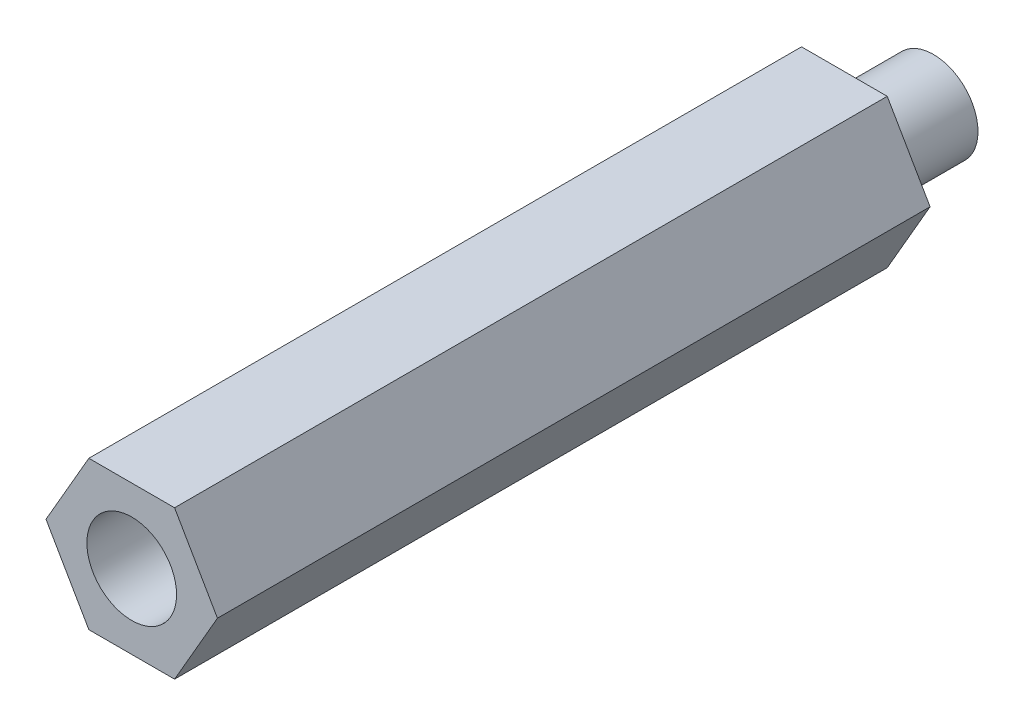
ISO-10303-21;
HEADER;
FILE_DESCRIPTION(('STEP AP214'),'2;1');
FILE_NAME('part.step','',(''),(''),'','','');
FILE_SCHEMA(('AUTOMOTIVE_DESIGN { 1 0 10303 214 1 1 1 1 }'));
ENDSEC;
DATA;
#1=APPLICATION_CONTEXT('core data for automotive mechanical design processes');
#2=APPLICATION_PROTOCOL_DEFINITION('international standard','automotive_design',2000,#1);
#3=PRODUCT_CONTEXT('',#1,'mechanical');
#4=PRODUCT('Part','Part','',(#3));
#5=PRODUCT_RELATED_PRODUCT_CATEGORY('part','',(#4));
#6=PRODUCT_DEFINITION_FORMATION('','',#4);
#7=PRODUCT_DEFINITION_CONTEXT('part definition',#1,'design');
#8=PRODUCT_DEFINITION('design','',#6,#7);
#9=PRODUCT_DEFINITION_SHAPE('','',#8);
#10=(LENGTH_UNIT() NAMED_UNIT(*) SI_UNIT(.MILLI.,.METRE.));
#11=(NAMED_UNIT(*) PLANE_ANGLE_UNIT() SI_UNIT($,.RADIAN.));
#12=(NAMED_UNIT(*) SI_UNIT($,.STERADIAN.) SOLID_ANGLE_UNIT());
#13=UNCERTAINTY_MEASURE_WITH_UNIT(LENGTH_MEASURE(1.E-05),#10,'distance_accuracy_value','');
#14=(GEOMETRIC_REPRESENTATION_CONTEXT(3) GLOBAL_UNCERTAINTY_ASSIGNED_CONTEXT((#13)) GLOBAL_UNIT_ASSIGNED_CONTEXT((#10,
#11,#12)) REPRESENTATION_CONTEXT('',''));
#15=CARTESIAN_POINT('',(0.,0.,0.));
#16=DIRECTION('',(0.,0.,1.));
#17=DIRECTION('',(1.,0.,0.));
#18=AXIS2_PLACEMENT_3D('',#15,#16,#17);
#19=CARTESIAN_POINT('',(0.,0.,24.));
#20=DIRECTION('',(0.,0.,1.));
#21=DIRECTION('',(1.,0.,0.));
#22=AXIS2_PLACEMENT_3D('',#19,#20,#21);
#23=PLANE('',#22);
#24=DIRECTION('',(0.5,0.866025403784439,0.));
#25=VECTOR('',#24,1.);
#26=CARTESIAN_POINT('',(1.44337567297406,-2.5,24.));
#27=LINE('',#26,#25);
#28=CARTESIAN_POINT('',(1.44337567297406,-2.5,24.));
#29=VERTEX_POINT('',#28);
#30=CARTESIAN_POINT('',(2.88675134594813,0.,24.));
#31=VERTEX_POINT('',#30);
#32=EDGE_CURVE('E145',#29,#31,#27,.T.);
#33=ORIENTED_EDGE('',*,*,#32,.T.);
#34=DIRECTION('',(-0.5,0.866025403784439,0.));
#35=VECTOR('',#34,1.);
#36=CARTESIAN_POINT('',(2.88675134594813,0.,24.));
#37=LINE('',#36,#35);
#38=CARTESIAN_POINT('',(1.44337567297406,2.5,24.));
#39=VERTEX_POINT('',#38);
#40=EDGE_CURVE('E105',#31,#39,#37,.T.);
#41=ORIENTED_EDGE('',*,*,#40,.T.);
#42=DIRECTION('',(-1.,0.,0.));
#43=VECTOR('',#42,1.);
#44=CARTESIAN_POINT('',(1.44337567297406,2.5,24.));
#45=LINE('',#44,#43);
#46=CARTESIAN_POINT('',(-1.44337567297406,2.5,24.));
#47=VERTEX_POINT('',#46);
#48=EDGE_CURVE('E113',#39,#47,#45,.T.);
#49=ORIENTED_EDGE('',*,*,#48,.T.);
#50=DIRECTION('',(-0.5,-0.866025403784439,0.));
#51=VECTOR('',#50,1.);
#52=CARTESIAN_POINT('',(-1.44337567297406,2.5,24.));
#53=LINE('',#52,#51);
#54=CARTESIAN_POINT('',(-2.88675134594813,0.,24.));
#55=VERTEX_POINT('',#54);
#56=EDGE_CURVE('E108',#47,#55,#53,.T.);
#57=ORIENTED_EDGE('',*,*,#56,.T.);
#58=DIRECTION('',(0.5,-0.866025403784439,0.));
#59=VECTOR('',#58,1.);
#60=CARTESIAN_POINT('',(-2.88675134594813,0.,24.));
#61=LINE('',#60,#59);
#62=CARTESIAN_POINT('',(-1.44337567297407,-2.5,24.));
#63=VERTEX_POINT('',#62);
#64=EDGE_CURVE('E114',#55,#63,#61,.T.);
#65=ORIENTED_EDGE('',*,*,#64,.T.);
#66=DIRECTION('',(1.,0.,0.));
#67=VECTOR('',#66,1.);
#68=CARTESIAN_POINT('',(-1.44337567297407,-2.5,24.));
#69=LINE('',#68,#67);
#70=EDGE_CURVE('E64',#63,#29,#69,.T.);
#71=ORIENTED_EDGE('',*,*,#70,.T.);
#72=EDGE_LOOP('',(#33,#41,#49,#57,#65,#71));
#73=FACE_BOUND('',#72,.T.);
#74=CARTESIAN_POINT('',(0.,0.,24.));
#75=DIRECTION('',(0.,0.,1.));
#76=DIRECTION('',(1.,0.,0.));
#77=AXIS2_PLACEMENT_3D('',#74,#75,#76);
#78=CIRCLE('',#77,1.51);
#79=CARTESIAN_POINT('',(1.51,0.,24.));
#80=VERTEX_POINT('',#79);
#81=EDGE_CURVE('E140',#80,#80,#78,.T.);
#82=ORIENTED_EDGE('',*,*,#81,.F.);
#83=EDGE_LOOP('',(#82));
#84=FACE_BOUND('',#83,.T.);
#85=ADVANCED_FACE('F50',(#73,#84),#23,.T.);
#86=CARTESIAN_POINT('',(0.,0.,0.));
#87=DIRECTION('',(0.,0.,1.));
#88=DIRECTION('',(1.,0.,0.));
#89=AXIS2_PLACEMENT_3D('',#86,#87,#88);
#90=PLANE('',#89);
#91=CARTESIAN_POINT('',(0.,0.,0.));
#92=DIRECTION('',(0.,0.,1.));
#93=DIRECTION('',(1.,0.,0.));
#94=AXIS2_PLACEMENT_3D('',#91,#92,#93);
#95=CIRCLE('',#94,1.5);
#96=CARTESIAN_POINT('',(1.5,0.,0.));
#97=VERTEX_POINT('',#96);
#98=EDGE_CURVE('E164',#97,#97,#95,.T.);
#99=ORIENTED_EDGE('',*,*,#98,.T.);
#100=EDGE_LOOP('',(#99));
#101=FACE_BOUND('',#100,.T.);
#102=DIRECTION('',(0.5,0.866025403784439,0.));
#103=VECTOR('',#102,1.);
#104=CARTESIAN_POINT('',(1.44337567297406,-2.5,0.));
#105=LINE('',#104,#103);
#106=CARTESIAN_POINT('',(1.44337567297406,-2.5,0.));
#107=VERTEX_POINT('',#106);
#108=CARTESIAN_POINT('',(2.88675134594813,0.,0.));
#109=VERTEX_POINT('',#108);
#110=EDGE_CURVE('E133',#107,#109,#105,.T.);
#111=ORIENTED_EDGE('',*,*,#110,.F.);
#112=DIRECTION('',(1.,0.,0.));
#113=VECTOR('',#112,1.);
#114=CARTESIAN_POINT('',(-1.44337567297407,-2.5,0.));
#115=LINE('',#114,#113);
#116=CARTESIAN_POINT('',(-1.44337567297407,-2.5,0.));
#117=VERTEX_POINT('',#116);
#118=EDGE_CURVE('E91',#117,#107,#115,.T.);
#119=ORIENTED_EDGE('',*,*,#118,.F.);
#120=DIRECTION('',(0.5,-0.866025403784439,0.));
#121=VECTOR('',#120,1.);
#122=CARTESIAN_POINT('',(-2.88675134594813,0.,0.));
#123=LINE('',#122,#121);
#124=CARTESIAN_POINT('',(-2.88675134594813,0.,0.));
#125=VERTEX_POINT('',#124);
#126=EDGE_CURVE('E87',#125,#117,#123,.T.);
#127=ORIENTED_EDGE('',*,*,#126,.F.);
#128=DIRECTION('',(-0.5,-0.866025403784439,0.));
#129=VECTOR('',#128,1.);
#130=CARTESIAN_POINT('',(-1.44337567297406,2.5,0.));
#131=LINE('',#130,#129);
#132=CARTESIAN_POINT('',(-1.44337567297406,2.5,0.));
#133=VERTEX_POINT('',#132);
#134=EDGE_CURVE('E123',#133,#125,#131,.T.);
#135=ORIENTED_EDGE('',*,*,#134,.F.);
#136=DIRECTION('',(-1.,0.,0.));
#137=VECTOR('',#136,1.);
#138=CARTESIAN_POINT('',(1.44337567297406,2.5,0.));
#139=LINE('',#138,#137);
#140=CARTESIAN_POINT('',(1.44337567297406,2.5,0.));
#141=VERTEX_POINT('',#140);
#142=EDGE_CURVE('E139',#141,#133,#139,.T.);
#143=ORIENTED_EDGE('',*,*,#142,.F.);
#144=DIRECTION('',(-0.5,0.866025403784439,0.));
#145=VECTOR('',#144,1.);
#146=CARTESIAN_POINT('',(2.88675134594813,0.,0.));
#147=LINE('',#146,#145);
#148=EDGE_CURVE('E137',#109,#141,#147,.T.);
#149=ORIENTED_EDGE('',*,*,#148,.F.);
#150=EDGE_LOOP('',(#111,#119,#127,#135,#143,#149));
#151=FACE_BOUND('',#150,.T.);
#152=ADVANCED_FACE('F156',(#101,#151),#90,.F.);
#153=CARTESIAN_POINT('',(1.44337567297406,-2.5,24.));
#154=DIRECTION('',(-0.866025403784439,0.5,0.));
#155=DIRECTION('',(-0.5,-0.866025403784439,0.));
#156=AXIS2_PLACEMENT_3D('',#153,#154,#155);
#157=PLANE('',#156);
#158=ORIENTED_EDGE('',*,*,#110,.T.);
#159=DIRECTION('',(0.,0.,-1.));
#160=VECTOR('',#159,1.);
#161=CARTESIAN_POINT('',(2.88675134594813,0.,24.));
#162=LINE('',#161,#160);
#163=EDGE_CURVE('E57',#31,#109,#162,.T.);
#164=ORIENTED_EDGE('',*,*,#163,.F.);
#165=ORIENTED_EDGE('',*,*,#32,.F.);
#166=DIRECTION('',(0.,0.,-1.));
#167=VECTOR('',#166,1.);
#168=CARTESIAN_POINT('',(1.44337567297406,-2.5,24.));
#169=LINE('',#168,#167);
#170=EDGE_CURVE('E129',#29,#107,#169,.T.);
#171=ORIENTED_EDGE('',*,*,#170,.T.);
#172=EDGE_LOOP('',(#158,#164,#165,#171));
#173=FACE_BOUND('',#172,.T.);
#174=ADVANCED_FACE('F47',(#173),#157,.F.);
#175=CARTESIAN_POINT('',(2.88675134594813,0.,24.));
#176=DIRECTION('',(-0.866025403784439,-0.5,0.));
#177=DIRECTION('',(0.5,-0.866025403784439,0.));
#178=AXIS2_PLACEMENT_3D('',#175,#176,#177);
#179=PLANE('',#178);
#180=ORIENTED_EDGE('',*,*,#148,.T.);
#181=DIRECTION('',(0.,0.,-1.));
#182=VECTOR('',#181,1.);
#183=CARTESIAN_POINT('',(1.44337567297406,2.5,24.));
#184=LINE('',#183,#182);
#185=EDGE_CURVE('E146',#39,#141,#184,.T.);
#186=ORIENTED_EDGE('',*,*,#185,.F.);
#187=ORIENTED_EDGE('',*,*,#40,.F.);
#188=ORIENTED_EDGE('',*,*,#163,.T.);
#189=EDGE_LOOP('',(#180,#186,#187,#188));
#190=FACE_BOUND('',#189,.T.);
#191=ADVANCED_FACE('F151',(#190),#179,.F.);
#192=CARTESIAN_POINT('',(1.44337567297406,2.5,24.));
#193=DIRECTION('',(0.,-1.,0.));
#194=DIRECTION('',(1.,0.,0.));
#195=AXIS2_PLACEMENT_3D('',#192,#193,#194);
#196=PLANE('',#195);
#197=ORIENTED_EDGE('',*,*,#142,.T.);
#198=DIRECTION('',(0.,0.,-1.));
#199=VECTOR('',#198,1.);
#200=CARTESIAN_POINT('',(-1.44337567297406,2.5,24.));
#201=LINE('',#200,#199);
#202=EDGE_CURVE('E124',#47,#133,#201,.T.);
#203=ORIENTED_EDGE('',*,*,#202,.F.);
#204=ORIENTED_EDGE('',*,*,#48,.F.);
#205=ORIENTED_EDGE('',*,*,#185,.T.);
#206=EDGE_LOOP('',(#197,#203,#204,#205));
#207=FACE_BOUND('',#206,.T.);
#208=ADVANCED_FACE('F157',(#207),#196,.F.);
#209=CARTESIAN_POINT('',(-1.44337567297406,2.5,24.));
#210=DIRECTION('',(0.866025403784438,-0.5,0.));
#211=DIRECTION('',(0.5,0.866025403784439,0.));
#212=AXIS2_PLACEMENT_3D('',#209,#210,#211);
#213=PLANE('',#212);
#214=ORIENTED_EDGE('',*,*,#134,.T.);
#215=DIRECTION('',(0.,0.,-1.));
#216=VECTOR('',#215,1.);
#217=CARTESIAN_POINT('',(-2.88675134594813,0.,24.));
#218=LINE('',#217,#216);
#219=EDGE_CURVE('E116',#55,#125,#218,.T.);
#220=ORIENTED_EDGE('',*,*,#219,.F.);
#221=ORIENTED_EDGE('',*,*,#56,.F.);
#222=ORIENTED_EDGE('',*,*,#202,.T.);
#223=EDGE_LOOP('',(#214,#220,#221,#222));
#224=FACE_BOUND('',#223,.T.);
#225=ADVANCED_FACE('F122',(#224),#213,.F.);
#226=CARTESIAN_POINT('',(-2.88675134594813,0.,24.));
#227=DIRECTION('',(0.866025403784439,0.5,0.));
#228=DIRECTION('',(-0.5,0.866025403784439,0.));
#229=AXIS2_PLACEMENT_3D('',#226,#227,#228);
#230=PLANE('',#229);
#231=ORIENTED_EDGE('',*,*,#126,.T.);
#232=DIRECTION('',(0.,0.,-1.));
#233=VECTOR('',#232,1.);
#234=CARTESIAN_POINT('',(-1.44337567297407,-2.5,24.));
#235=LINE('',#234,#233);
#236=EDGE_CURVE('E121',#63,#117,#235,.T.);
#237=ORIENTED_EDGE('',*,*,#236,.F.);
#238=ORIENTED_EDGE('',*,*,#64,.F.);
#239=ORIENTED_EDGE('',*,*,#219,.T.);
#240=EDGE_LOOP('',(#231,#237,#238,#239));
#241=FACE_BOUND('',#240,.T.);
#242=ADVANCED_FACE('F130',(#241),#230,.F.);
#243=CARTESIAN_POINT('',(-1.44337567297407,-2.5,24.));
#244=DIRECTION('',(0.,1.,0.));
#245=DIRECTION('',(-1.,0.,0.));
#246=AXIS2_PLACEMENT_3D('',#243,#244,#245);
#247=PLANE('',#246);
#248=ORIENTED_EDGE('',*,*,#118,.T.);
#249=ORIENTED_EDGE('',*,*,#170,.F.);
#250=ORIENTED_EDGE('',*,*,#70,.F.);
#251=ORIENTED_EDGE('',*,*,#236,.T.);
#252=EDGE_LOOP('',(#248,#249,#250,#251));
#253=FACE_BOUND('',#252,.T.);
#254=ADVANCED_FACE('F191',(#253),#247,.F.);
#255=CARTESIAN_POINT('',(0.,0.,24.));
#256=DIRECTION('',(0.,0.,-1.));
#257=DIRECTION('',(-1.,0.,0.));
#258=AXIS2_PLACEMENT_3D('',#255,#256,#257);
#259=CYLINDRICAL_SURFACE('',#258,1.51);
#260=CARTESIAN_POINT('',(0.,0.,0.449999999999999));
#261=DIRECTION('',(0.,0.,1.));
#262=DIRECTION('',(1.,0.,0.));
#263=AXIS2_PLACEMENT_3D('',#260,#261,#262);
#264=CIRCLE('',#263,1.51);
#265=CARTESIAN_POINT('',(1.51,0.,0.449999999999999));
#266=VERTEX_POINT('',#265);
#267=EDGE_CURVE('E11',#266,#266,#264,.T.);
#268=ORIENTED_EDGE('',*,*,#267,.F.);
#269=EDGE_LOOP('',(#268));
#270=FACE_BOUND('',#269,.T.);
#271=ORIENTED_EDGE('',*,*,#81,.T.);
#272=EDGE_LOOP('',(#271));
#273=FACE_BOUND('',#272,.T.);
#274=ADVANCED_FACE('F195',(#270,#273),#259,.F.);
#275=CARTESIAN_POINT('',(0.,0.,0.45));
#276=DIRECTION('',(0.,0.,1.));
#277=DIRECTION('',(1.,0.,0.));
#278=AXIS2_PLACEMENT_3D('',#275,#276,#277);
#279=PLANE('',#278);
#280=ORIENTED_EDGE('',*,*,#267,.T.);
#281=EDGE_LOOP('',(#280));
#282=FACE_BOUND('',#281,.T.);
#283=ADVANCED_FACE('F180',(#282),#279,.T.);
#284=CARTESIAN_POINT('',(0.,0.,0.));
#285=DIRECTION('',(0.,0.,-1.));
#286=DIRECTION('',(-1.,0.,0.));
#287=AXIS2_PLACEMENT_3D('',#284,#285,#286);
#288=CYLINDRICAL_SURFACE('',#287,1.5);
#289=ORIENTED_EDGE('',*,*,#98,.F.);
#290=EDGE_LOOP('',(#289));
#291=FACE_BOUND('',#290,.T.);
#292=CARTESIAN_POINT('',(0.,0.,-3.));
#293=DIRECTION('',(0.,0.,1.));
#294=DIRECTION('',(1.,0.,0.));
#295=AXIS2_PLACEMENT_3D('',#292,#293,#294);
#296=CIRCLE('',#295,1.5);
#297=CARTESIAN_POINT('',(1.5,0.,-3.));
#298=VERTEX_POINT('',#297);
#299=EDGE_CURVE('E167',#298,#298,#296,.T.);
#300=ORIENTED_EDGE('',*,*,#299,.T.);
#301=EDGE_LOOP('',(#300));
#302=FACE_BOUND('',#301,.T.);
#303=ADVANCED_FACE('F173',(#291,#302),#288,.T.);
#304=CARTESIAN_POINT('',(0.,0.,-3.));
#305=DIRECTION('',(0.,0.,1.));
#306=DIRECTION('',(1.,0.,0.));
#307=AXIS2_PLACEMENT_3D('',#304,#305,#306);
#308=PLANE('',#307);
#309=ORIENTED_EDGE('',*,*,#299,.F.);
#310=EDGE_LOOP('',(#309));
#311=FACE_BOUND('',#310,.T.);
#312=ADVANCED_FACE('F177',(#311),#308,.F.);
#313=CLOSED_SHELL('',(#85,#152,#174,#191,#208,#225,#242,#254,#274,#283,#303,#312));
#314=MANIFOLD_SOLID_BREP('B2',#313);
#315=ADVANCED_BREP_SHAPE_REPRESENTATION('',(#18,#314),#14);
#316=SHAPE_DEFINITION_REPRESENTATION(#9,#315);
ENDSEC;
END-ISO-10303-21;
